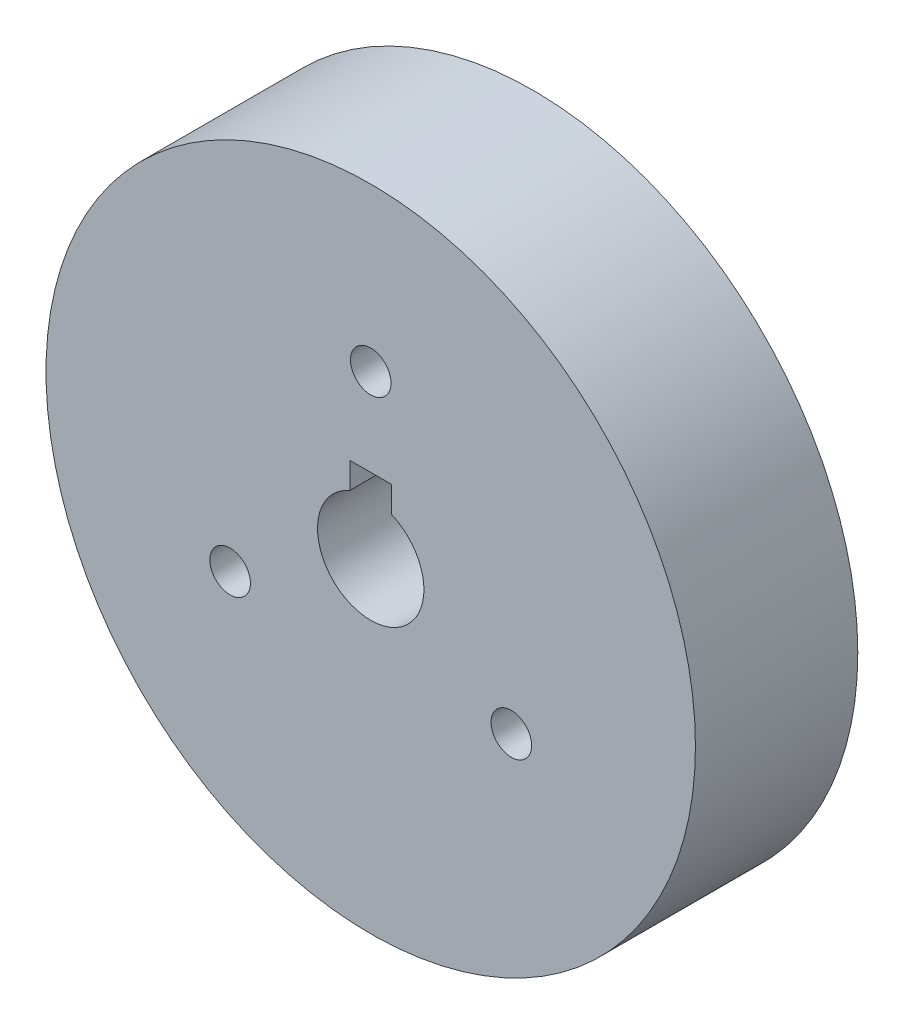
ISO-10303-21;
HEADER;
FILE_DESCRIPTION(('STEP AP214'),'2;1');
FILE_NAME('part.step','',(''),(''),'','','');
FILE_SCHEMA(('AUTOMOTIVE_DESIGN { 1 0 10303 214 1 1 1 1 }'));
ENDSEC;
DATA;
#1=APPLICATION_CONTEXT('core data for automotive mechanical design processes');
#2=APPLICATION_PROTOCOL_DEFINITION('international standard','automotive_design',2000,#1);
#3=PRODUCT_CONTEXT('',#1,'mechanical');
#4=PRODUCT('Part','Part','',(#3));
#5=PRODUCT_RELATED_PRODUCT_CATEGORY('part','',(#4));
#6=PRODUCT_DEFINITION_FORMATION('','',#4);
#7=PRODUCT_DEFINITION_CONTEXT('part definition',#1,'design');
#8=PRODUCT_DEFINITION('design','',#6,#7);
#9=PRODUCT_DEFINITION_SHAPE('','',#8);
#10=(LENGTH_UNIT() NAMED_UNIT(*) SI_UNIT(.MILLI.,.METRE.));
#11=(NAMED_UNIT(*) PLANE_ANGLE_UNIT() SI_UNIT($,.RADIAN.));
#12=(NAMED_UNIT(*) SI_UNIT($,.STERADIAN.) SOLID_ANGLE_UNIT());
#13=UNCERTAINTY_MEASURE_WITH_UNIT(LENGTH_MEASURE(1.E-05),#10,'distance_accuracy_value','');
#14=(GEOMETRIC_REPRESENTATION_CONTEXT(3) GLOBAL_UNCERTAINTY_ASSIGNED_CONTEXT((#13)) GLOBAL_UNIT_ASSIGNED_CONTEXT((#10,
#11,#12)) REPRESENTATION_CONTEXT('',''));
#15=CARTESIAN_POINT('',(0.,0.,0.));
#16=DIRECTION('',(0.,0.,1.));
#17=DIRECTION('',(1.,0.,0.));
#18=AXIS2_PLACEMENT_3D('',#15,#16,#17);
#19=CARTESIAN_POINT('',(0.,0.,10.));
#20=DIRECTION('',(0.,0.,1.));
#21=DIRECTION('',(1.,0.,0.));
#22=AXIS2_PLACEMENT_3D('',#19,#20,#21);
#23=PLANE('',#22);
#24=DIRECTION('',(0.,-1.,0.));
#25=VECTOR('',#24,1.);
#26=CARTESIAN_POINT('',(-1.290625,0.,10.));
#27=LINE('',#26,#25);
#28=CARTESIAN_POINT('',(-1.290625,4.615625,10.));
#29=VERTEX_POINT('',#28);
#30=CARTESIAN_POINT('',(-1.290625,3.00996878877091,10.));
#31=VERTEX_POINT('',#30);
#32=EDGE_CURVE('E55',#29,#31,#27,.T.);
#33=ORIENTED_EDGE('',*,*,#32,.F.);
#34=DIRECTION('',(-1.,0.,0.));
#35=VECTOR('',#34,1.);
#36=CARTESIAN_POINT('',(0.,4.615625,10.));
#37=LINE('',#36,#35);
#38=CARTESIAN_POINT('',(1.290625,4.615625,10.));
#39=VERTEX_POINT('',#38);
#40=EDGE_CURVE('E99',#39,#29,#37,.T.);
#41=ORIENTED_EDGE('',*,*,#40,.F.);
#42=DIRECTION('',(0.,1.,0.));
#43=VECTOR('',#42,1.);
#44=CARTESIAN_POINT('',(1.290625,0.,10.));
#45=LINE('',#44,#43);
#46=CARTESIAN_POINT('',(1.290625,3.00996878877091,10.));
#47=VERTEX_POINT('',#46);
#48=EDGE_CURVE('E76',#47,#39,#45,.T.);
#49=ORIENTED_EDGE('',*,*,#48,.F.);
#50=CARTESIAN_POINT('',(0.,0.,10.));
#51=DIRECTION('',(0.,0.,1.));
#52=DIRECTION('',(1.,0.,0.));
#53=AXIS2_PLACEMENT_3D('',#50,#51,#52);
#54=CIRCLE('',#53,3.275);
#55=EDGE_CURVE('E101',#31,#47,#54,.T.);
#56=ORIENTED_EDGE('',*,*,#55,.F.);
#57=EDGE_LOOP('',(#33,#41,#49,#56));
#58=FACE_BOUND('',#57,.T.);
#59=CARTESIAN_POINT('',(0.,10.,10.));
#60=DIRECTION('',(0.,0.,1.));
#61=DIRECTION('',(1.,0.,0.));
#62=AXIS2_PLACEMENT_3D('',#59,#60,#61);
#63=CIRCLE('',#62,1.2504794715155);
#64=CARTESIAN_POINT('',(1.2504794715155,10.,10.));
#65=VERTEX_POINT('',#64);
#66=EDGE_CURVE('E106',#65,#65,#63,.T.);
#67=ORIENTED_EDGE('',*,*,#66,.F.);
#68=EDGE_LOOP('',(#67));
#69=FACE_BOUND('',#68,.T.);
#70=CARTESIAN_POINT('',(8.66025403784503,-4.99999999999963,10.));
#71=DIRECTION('',(0.,0.,1.));
#72=DIRECTION('',(1.,0.,0.));
#73=AXIS2_PLACEMENT_3D('',#70,#71,#72);
#74=CIRCLE('',#73,1.25047947151605);
#75=CARTESIAN_POINT('',(9.91073350936107,-4.99999999999963,10.));
#76=VERTEX_POINT('',#75);
#77=EDGE_CURVE('E118',#76,#76,#74,.T.);
#78=ORIENTED_EDGE('',*,*,#77,.F.);
#79=EDGE_LOOP('',(#78));
#80=FACE_BOUND('',#79,.T.);
#81=CARTESIAN_POINT('',(0.,0.,10.));
#82=DIRECTION('',(0.,0.,1.));
#83=DIRECTION('',(1.,0.,0.));
#84=AXIS2_PLACEMENT_3D('',#81,#82,#83);
#85=CIRCLE('',#84,20.);
#86=CARTESIAN_POINT('',(20.,0.,10.));
#87=VERTEX_POINT('',#86);
#88=EDGE_CURVE('E124',#87,#87,#85,.T.);
#89=ORIENTED_EDGE('',*,*,#88,.T.);
#90=EDGE_LOOP('',(#89));
#91=FACE_BOUND('',#90,.T.);
#92=CARTESIAN_POINT('',(-8.66025403784375,-5.00000000000037,10.));
#93=DIRECTION('',(0.,0.,1.));
#94=DIRECTION('',(1.,0.,0.));
#95=AXIS2_PLACEMENT_3D('',#92,#93,#94);
#96=CIRCLE('',#95,1.25047947151631);
#97=CARTESIAN_POINT('',(-7.40977456632744,-5.00000000000037,10.));
#98=VERTEX_POINT('',#97);
#99=EDGE_CURVE('E112',#98,#98,#96,.T.);
#100=ORIENTED_EDGE('',*,*,#99,.F.);
#101=EDGE_LOOP('',(#100));
#102=FACE_BOUND('',#101,.T.);
#103=ADVANCED_FACE('F33',(#58,#69,#80,#91,#102),#23,.T.);
#104=CARTESIAN_POINT('',(0.,0.,0.));
#105=DIRECTION('',(0.,0.,1.));
#106=DIRECTION('',(1.,0.,0.));
#107=AXIS2_PLACEMENT_3D('',#104,#105,#106);
#108=PLANE('',#107);
#109=CARTESIAN_POINT('',(0.,0.,0.));
#110=DIRECTION('',(0.,0.,1.));
#111=DIRECTION('',(1.,0.,0.));
#112=AXIS2_PLACEMENT_3D('',#109,#110,#111);
#113=CIRCLE('',#112,20.);
#114=CARTESIAN_POINT('',(20.,0.,0.));
#115=VERTEX_POINT('',#114);
#116=EDGE_CURVE('E121',#115,#115,#113,.T.);
#117=ORIENTED_EDGE('',*,*,#116,.F.);
#118=EDGE_LOOP('',(#117));
#119=FACE_BOUND('',#118,.T.);
#120=CARTESIAN_POINT('',(8.66025403784503,-4.99999999999963,0.));
#121=DIRECTION('',(0.,0.,1.));
#122=DIRECTION('',(1.,0.,0.));
#123=AXIS2_PLACEMENT_3D('',#120,#121,#122);
#124=CIRCLE('',#123,1.25047947151605);
#125=CARTESIAN_POINT('',(9.91073350936107,-4.99999999999963,0.));
#126=VERTEX_POINT('',#125);
#127=EDGE_CURVE('E115',#126,#126,#124,.T.);
#128=ORIENTED_EDGE('',*,*,#127,.T.);
#129=EDGE_LOOP('',(#128));
#130=FACE_BOUND('',#129,.T.);
#131=CARTESIAN_POINT('',(-8.66025403784375,-5.00000000000037,0.));
#132=DIRECTION('',(0.,0.,1.));
#133=DIRECTION('',(1.,0.,0.));
#134=AXIS2_PLACEMENT_3D('',#131,#132,#133);
#135=CIRCLE('',#134,1.25047947151631);
#136=CARTESIAN_POINT('',(-7.40977456632744,-5.00000000000037,0.));
#137=VERTEX_POINT('',#136);
#138=EDGE_CURVE('E109',#137,#137,#135,.T.);
#139=ORIENTED_EDGE('',*,*,#138,.T.);
#140=EDGE_LOOP('',(#139));
#141=FACE_BOUND('',#140,.T.);
#142=CARTESIAN_POINT('',(0.,10.,0.));
#143=DIRECTION('',(0.,0.,1.));
#144=DIRECTION('',(1.,0.,0.));
#145=AXIS2_PLACEMENT_3D('',#142,#143,#144);
#146=CIRCLE('',#145,1.2504794715155);
#147=CARTESIAN_POINT('',(1.2504794715155,10.,0.));
#148=VERTEX_POINT('',#147);
#149=EDGE_CURVE('E104',#148,#148,#146,.T.);
#150=ORIENTED_EDGE('',*,*,#149,.T.);
#151=EDGE_LOOP('',(#150));
#152=FACE_BOUND('',#151,.T.);
#153=DIRECTION('',(-1.,0.,0.));
#154=VECTOR('',#153,1.);
#155=CARTESIAN_POINT('',(-1.290625,4.615625,0.));
#156=LINE('',#155,#154);
#157=CARTESIAN_POINT('',(1.290625,4.615625,0.));
#158=VERTEX_POINT('',#157);
#159=CARTESIAN_POINT('',(-1.290625,4.615625,0.));
#160=VERTEX_POINT('',#159);
#161=EDGE_CURVE('E80',#158,#160,#156,.T.);
#162=ORIENTED_EDGE('',*,*,#161,.T.);
#163=DIRECTION('',(0.,-1.,0.));
#164=VECTOR('',#163,1.);
#165=CARTESIAN_POINT('',(-1.290625,0.,0.));
#166=LINE('',#165,#164);
#167=CARTESIAN_POINT('',(-1.290625,3.00996878877091,0.));
#168=VERTEX_POINT('',#167);
#169=EDGE_CURVE('E92',#160,#168,#166,.T.);
#170=ORIENTED_EDGE('',*,*,#169,.T.);
#171=CARTESIAN_POINT('',(0.,0.,0.));
#172=DIRECTION('',(0.,0.,1.));
#173=DIRECTION('',(1.,0.,0.));
#174=AXIS2_PLACEMENT_3D('',#171,#172,#173);
#175=CIRCLE('',#174,3.275);
#176=CARTESIAN_POINT('',(1.290625,3.00996878877091,0.));
#177=VERTEX_POINT('',#176);
#178=EDGE_CURVE('E91',#168,#177,#175,.T.);
#179=ORIENTED_EDGE('',*,*,#178,.T.);
#180=DIRECTION('',(0.,1.,0.));
#181=VECTOR('',#180,1.);
#182=CARTESIAN_POINT('',(1.290625,0.,0.));
#183=LINE('',#182,#181);
#184=EDGE_CURVE('E48',#177,#158,#183,.T.);
#185=ORIENTED_EDGE('',*,*,#184,.T.);
#186=EDGE_LOOP('',(#162,#170,#179,#185));
#187=FACE_BOUND('',#186,.T.);
#188=ADVANCED_FACE('F89',(#119,#130,#141,#152,#187),#108,.F.);
#189=CARTESIAN_POINT('',(0.,0.,10.));
#190=DIRECTION('',(0.,0.,-1.));
#191=DIRECTION('',(-1.,0.,0.));
#192=AXIS2_PLACEMENT_3D('',#189,#190,#191);
#193=CYLINDRICAL_SURFACE('',#192,20.);
#194=ORIENTED_EDGE('',*,*,#88,.F.);
#195=EDGE_LOOP('',(#194));
#196=FACE_BOUND('',#195,.T.);
#197=ORIENTED_EDGE('',*,*,#116,.T.);
#198=EDGE_LOOP('',(#197));
#199=FACE_BOUND('',#198,.T.);
#200=ADVANCED_FACE('F35',(#196,#199),#193,.T.);
#201=CARTESIAN_POINT('',(8.66025403784503,-4.99999999999963,10.));
#202=DIRECTION('',(0.,0.,-1.));
#203=DIRECTION('',(-1.,0.,0.));
#204=AXIS2_PLACEMENT_3D('',#201,#202,#203);
#205=CYLINDRICAL_SURFACE('',#204,1.25047947151605);
#206=ORIENTED_EDGE('',*,*,#77,.T.);
#207=EDGE_LOOP('',(#206));
#208=FACE_BOUND('',#207,.T.);
#209=ORIENTED_EDGE('',*,*,#127,.F.);
#210=EDGE_LOOP('',(#209));
#211=FACE_BOUND('',#210,.T.);
#212=ADVANCED_FACE('F151',(#208,#211),#205,.F.);
#213=CARTESIAN_POINT('',(-8.66025403784375,-5.00000000000037,10.));
#214=DIRECTION('',(0.,0.,-1.));
#215=DIRECTION('',(-1.,0.,0.));
#216=AXIS2_PLACEMENT_3D('',#213,#214,#215);
#217=CYLINDRICAL_SURFACE('',#216,1.25047947151631);
#218=ORIENTED_EDGE('',*,*,#99,.T.);
#219=EDGE_LOOP('',(#218));
#220=FACE_BOUND('',#219,.T.);
#221=ORIENTED_EDGE('',*,*,#138,.F.);
#222=EDGE_LOOP('',(#221));
#223=FACE_BOUND('',#222,.T.);
#224=ADVANCED_FACE('F154',(#220,#223),#217,.F.);
#225=CARTESIAN_POINT('',(0.,10.,10.));
#226=DIRECTION('',(0.,0.,-1.));
#227=DIRECTION('',(-1.,0.,0.));
#228=AXIS2_PLACEMENT_3D('',#225,#226,#227);
#229=CYLINDRICAL_SURFACE('',#228,1.2504794715155);
#230=ORIENTED_EDGE('',*,*,#66,.T.);
#231=EDGE_LOOP('',(#230));
#232=FACE_BOUND('',#231,.T.);
#233=ORIENTED_EDGE('',*,*,#149,.F.);
#234=EDGE_LOOP('',(#233));
#235=FACE_BOUND('',#234,.T.);
#236=ADVANCED_FACE('F141',(#232,#235),#229,.F.);
#237=CARTESIAN_POINT('',(0.,0.,10.));
#238=DIRECTION('',(0.,0.,-1.));
#239=DIRECTION('',(-1.,0.,0.));
#240=AXIS2_PLACEMENT_3D('',#237,#238,#239);
#241=CYLINDRICAL_SURFACE('',#240,3.275);
#242=DIRECTION('',(0.,0.,-1.));
#243=VECTOR('',#242,1.);
#244=CARTESIAN_POINT('',(-1.290625,3.00996878877091,10.));
#245=LINE('',#244,#243);
#246=EDGE_CURVE('E11',#31,#168,#245,.T.);
#247=ORIENTED_EDGE('',*,*,#246,.F.);
#248=ORIENTED_EDGE('',*,*,#55,.T.);
#249=DIRECTION('',(0.,0.,-1.));
#250=VECTOR('',#249,1.);
#251=CARTESIAN_POINT('',(1.290625,3.00996878877091,10.));
#252=LINE('',#251,#250);
#253=EDGE_CURVE('E41',#177,#47,#252,.F.);
#254=ORIENTED_EDGE('',*,*,#253,.F.);
#255=ORIENTED_EDGE('',*,*,#178,.F.);
#256=EDGE_LOOP('',(#247,#248,#254,#255));
#257=FACE_BOUND('',#256,.T.);
#258=ADVANCED_FACE('F132',(#257),#241,.F.);
#259=CARTESIAN_POINT('',(-1.290625,0.,0.));
#260=DIRECTION('',(-1.,0.,0.));
#261=DIRECTION('',(0.,0.,1.));
#262=AXIS2_PLACEMENT_3D('',#259,#260,#261);
#263=PLANE('',#262);
#264=ORIENTED_EDGE('',*,*,#32,.T.);
#265=ORIENTED_EDGE('',*,*,#246,.T.);
#266=ORIENTED_EDGE('',*,*,#169,.F.);
#267=DIRECTION('',(0.,0.,1.));
#268=VECTOR('',#267,1.);
#269=CARTESIAN_POINT('',(-1.290625,4.615625,0.));
#270=LINE('',#269,#268);
#271=EDGE_CURVE('E79',#160,#29,#270,.T.);
#272=ORIENTED_EDGE('',*,*,#271,.T.);
#273=EDGE_LOOP('',(#264,#265,#266,#272));
#274=FACE_BOUND('',#273,.T.);
#275=ADVANCED_FACE('F133',(#274),#263,.F.);
#276=CARTESIAN_POINT('',(-1.290625,4.615625,0.));
#277=DIRECTION('',(0.,1.,0.));
#278=DIRECTION('',(-1.,0.,0.));
#279=AXIS2_PLACEMENT_3D('',#276,#277,#278);
#280=PLANE('',#279);
#281=ORIENTED_EDGE('',*,*,#40,.T.);
#282=ORIENTED_EDGE('',*,*,#271,.F.);
#283=ORIENTED_EDGE('',*,*,#161,.F.);
#284=DIRECTION('',(0.,0.,1.));
#285=VECTOR('',#284,1.);
#286=CARTESIAN_POINT('',(1.290625,4.615625,0.));
#287=LINE('',#286,#285);
#288=EDGE_CURVE('E72',#158,#39,#287,.T.);
#289=ORIENTED_EDGE('',*,*,#288,.T.);
#290=EDGE_LOOP('',(#281,#282,#283,#289));
#291=FACE_BOUND('',#290,.T.);
#292=ADVANCED_FACE('F83',(#291),#280,.F.);
#293=CARTESIAN_POINT('',(1.290625,0.,0.));
#294=DIRECTION('',(1.,0.,0.));
#295=DIRECTION('',(0.,1.,0.));
#296=AXIS2_PLACEMENT_3D('',#293,#294,#295);
#297=PLANE('',#296);
#298=ORIENTED_EDGE('',*,*,#48,.T.);
#299=ORIENTED_EDGE('',*,*,#288,.F.);
#300=ORIENTED_EDGE('',*,*,#184,.F.);
#301=ORIENTED_EDGE('',*,*,#253,.T.);
#302=EDGE_LOOP('',(#298,#299,#300,#301));
#303=FACE_BOUND('',#302,.T.);
#304=ADVANCED_FACE('F74',(#303),#297,.F.);
#305=CLOSED_SHELL('',(#103,#188,#200,#212,#224,#236,#258,#275,#292,#304));
#306=MANIFOLD_SOLID_BREP('B2',#305);
#307=ADVANCED_BREP_SHAPE_REPRESENTATION('',(#18,#306),#14);
#308=SHAPE_DEFINITION_REPRESENTATION(#9,#307);
ENDSEC;
END-ISO-10303-21;
